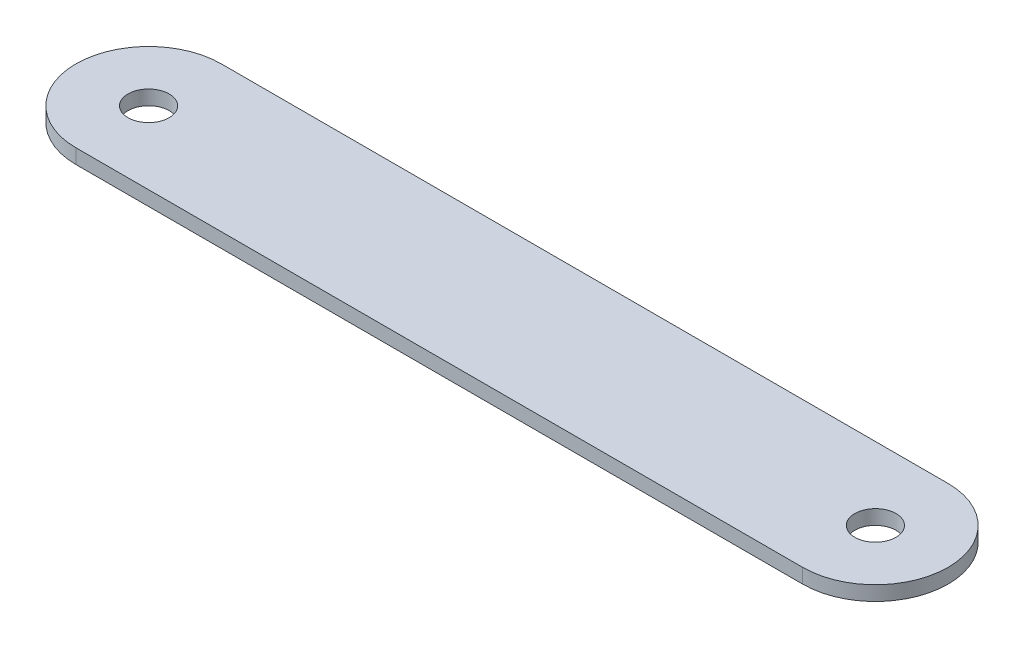
ISO-10303-21;
HEADER;
FILE_DESCRIPTION(('STEP AP214'),'2;1');
FILE_NAME('part.step','',(''),(''),'','','');
FILE_SCHEMA(('AUTOMOTIVE_DESIGN { 1 0 10303 214 1 1 1 1 }'));
ENDSEC;
DATA;
#1=APPLICATION_CONTEXT('core data for automotive mechanical design processes');
#2=APPLICATION_PROTOCOL_DEFINITION('international standard','automotive_design',2000,#1);
#3=PRODUCT_CONTEXT('',#1,'mechanical');
#4=PRODUCT('Part','Part','',(#3));
#5=PRODUCT_RELATED_PRODUCT_CATEGORY('part','',(#4));
#6=PRODUCT_DEFINITION_FORMATION('','',#4);
#7=PRODUCT_DEFINITION_CONTEXT('part definition',#1,'design');
#8=PRODUCT_DEFINITION('design','',#6,#7);
#9=PRODUCT_DEFINITION_SHAPE('','',#8);
#10=(LENGTH_UNIT() NAMED_UNIT(*) SI_UNIT(.MILLI.,.METRE.));
#11=(NAMED_UNIT(*) PLANE_ANGLE_UNIT() SI_UNIT($,.RADIAN.));
#12=(NAMED_UNIT(*) SI_UNIT($,.STERADIAN.) SOLID_ANGLE_UNIT());
#13=UNCERTAINTY_MEASURE_WITH_UNIT(LENGTH_MEASURE(1.E-05),#10,'distance_accuracy_value','');
#14=(GEOMETRIC_REPRESENTATION_CONTEXT(3) GLOBAL_UNCERTAINTY_ASSIGNED_CONTEXT((#13)) GLOBAL_UNIT_ASSIGNED_CONTEXT((#10,
#11,#12)) REPRESENTATION_CONTEXT('',''));
#15=CARTESIAN_POINT('',(0.,0.,0.));
#16=DIRECTION('',(0.,0.,1.));
#17=DIRECTION('',(1.,0.,0.));
#18=AXIS2_PLACEMENT_3D('',#15,#16,#17);
#19=CARTESIAN_POINT('',(100.,3.,0.));
#20=DIRECTION('',(0.,-1.,0.));
#21=DIRECTION('',(0.,0.,-1.));
#22=AXIS2_PLACEMENT_3D('',#19,#20,#21);
#23=CYLINDRICAL_SURFACE('',#22,15.);
#24=CARTESIAN_POINT('',(100.,0.,0.));
#25=DIRECTION('',(0.,1.,0.));
#26=DIRECTION('',(0.,0.,-1.));
#27=AXIS2_PLACEMENT_3D('',#24,#25,#26);
#28=CIRCLE('',#27,15.);
#29=CARTESIAN_POINT('',(100.,0.,15.));
#30=VERTEX_POINT('',#29);
#31=CARTESIAN_POINT('',(100.,0.,-15.));
#32=VERTEX_POINT('',#31);
#33=EDGE_CURVE('E113',#30,#32,#28,.T.);
#34=ORIENTED_EDGE('',*,*,#33,.T.);
#35=DIRECTION('',(0.,-1.,0.));
#36=VECTOR('',#35,1.);
#37=CARTESIAN_POINT('',(100.,3.,-15.));
#38=LINE('',#37,#36);
#39=CARTESIAN_POINT('',(100.,3.,-15.));
#40=VERTEX_POINT('',#39);
#41=EDGE_CURVE('E11',#40,#32,#38,.T.);
#42=ORIENTED_EDGE('',*,*,#41,.F.);
#43=CARTESIAN_POINT('',(100.,3.,0.));
#44=DIRECTION('',(0.,1.,0.));
#45=DIRECTION('',(0.,0.,-1.));
#46=AXIS2_PLACEMENT_3D('',#43,#44,#45);
#47=CIRCLE('',#46,15.);
#48=CARTESIAN_POINT('',(100.,3.,15.));
#49=VERTEX_POINT('',#48);
#50=EDGE_CURVE('E96',#49,#40,#47,.T.);
#51=ORIENTED_EDGE('',*,*,#50,.F.);
#52=DIRECTION('',(0.,-1.,0.));
#53=VECTOR('',#52,1.);
#54=CARTESIAN_POINT('',(100.,3.,15.));
#55=LINE('',#54,#53);
#56=EDGE_CURVE('E109',#49,#30,#55,.T.);
#57=ORIENTED_EDGE('',*,*,#56,.T.);
#58=EDGE_LOOP('',(#34,#42,#51,#57));
#59=FACE_BOUND('',#58,.T.);
#60=ADVANCED_FACE('F42',(#59),#23,.T.);
#61=CARTESIAN_POINT('',(-50.,3.,-15.));
#62=DIRECTION('',(0.,0.,1.));
#63=DIRECTION('',(1.,0.,0.));
#64=AXIS2_PLACEMENT_3D('',#61,#62,#63);
#65=PLANE('',#64);
#66=DIRECTION('',(-1.,0.,0.));
#67=VECTOR('',#66,1.);
#68=CARTESIAN_POINT('',(-50.,0.,-15.));
#69=LINE('',#68,#67);
#70=CARTESIAN_POINT('',(-50.,0.,-15.));
#71=VERTEX_POINT('',#70);
#72=EDGE_CURVE('E101',#32,#71,#69,.T.);
#73=ORIENTED_EDGE('',*,*,#72,.T.);
#74=DIRECTION('',(0.,-1.,0.));
#75=VECTOR('',#74,1.);
#76=CARTESIAN_POINT('',(-50.,3.,-15.));
#77=LINE('',#76,#75);
#78=CARTESIAN_POINT('',(-50.,3.,-15.));
#79=VERTEX_POINT('',#78);
#80=EDGE_CURVE('E52',#79,#71,#77,.T.);
#81=ORIENTED_EDGE('',*,*,#80,.F.);
#82=DIRECTION('',(-1.,0.,0.));
#83=VECTOR('',#82,1.);
#84=CARTESIAN_POINT('',(-50.,3.,-15.));
#85=LINE('',#84,#83);
#86=EDGE_CURVE('E91',#40,#79,#85,.T.);
#87=ORIENTED_EDGE('',*,*,#86,.F.);
#88=ORIENTED_EDGE('',*,*,#41,.T.);
#89=EDGE_LOOP('',(#73,#81,#87,#88));
#90=FACE_BOUND('',#89,.T.);
#91=ADVANCED_FACE('F100',(#90),#65,.F.);
#92=CARTESIAN_POINT('',(-50.,3.,0.));
#93=DIRECTION('',(0.,-1.,0.));
#94=DIRECTION('',(0.,0.,-1.));
#95=AXIS2_PLACEMENT_3D('',#92,#93,#94);
#96=CYLINDRICAL_SURFACE('',#95,15.);
#97=CARTESIAN_POINT('',(-50.,0.,0.));
#98=DIRECTION('',(0.,1.,0.));
#99=DIRECTION('',(0.,0.,1.));
#100=AXIS2_PLACEMENT_3D('',#97,#98,#99);
#101=CIRCLE('',#100,15.);
#102=CARTESIAN_POINT('',(-50.,0.,15.));
#103=VERTEX_POINT('',#102);
#104=EDGE_CURVE('E78',#71,#103,#101,.T.);
#105=ORIENTED_EDGE('',*,*,#104,.T.);
#106=DIRECTION('',(0.,-1.,0.));
#107=VECTOR('',#106,1.);
#108=CARTESIAN_POINT('',(-50.,3.,15.));
#109=LINE('',#108,#107);
#110=CARTESIAN_POINT('',(-50.,3.,15.));
#111=VERTEX_POINT('',#110);
#112=EDGE_CURVE('E103',#111,#103,#109,.T.);
#113=ORIENTED_EDGE('',*,*,#112,.F.);
#114=CARTESIAN_POINT('',(-50.,3.,0.));
#115=DIRECTION('',(0.,1.,0.));
#116=DIRECTION('',(0.,0.,1.));
#117=AXIS2_PLACEMENT_3D('',#114,#115,#116);
#118=CIRCLE('',#117,15.);
#119=EDGE_CURVE('E94',#79,#111,#118,.T.);
#120=ORIENTED_EDGE('',*,*,#119,.F.);
#121=ORIENTED_EDGE('',*,*,#80,.T.);
#122=EDGE_LOOP('',(#105,#113,#120,#121));
#123=FACE_BOUND('',#122,.T.);
#124=ADVANCED_FACE('F105',(#123),#96,.T.);
#125=CARTESIAN_POINT('',(-50.,3.,15.));
#126=DIRECTION('',(0.,0.,-1.));
#127=DIRECTION('',(-1.,0.,0.));
#128=AXIS2_PLACEMENT_3D('',#125,#126,#127);
#129=PLANE('',#128);
#130=DIRECTION('',(1.,0.,0.));
#131=VECTOR('',#130,1.);
#132=CARTESIAN_POINT('',(-50.,0.,15.));
#133=LINE('',#132,#131);
#134=EDGE_CURVE('E84',#103,#30,#133,.T.);
#135=ORIENTED_EDGE('',*,*,#134,.T.);
#136=ORIENTED_EDGE('',*,*,#56,.F.);
#137=DIRECTION('',(1.,0.,0.));
#138=VECTOR('',#137,1.);
#139=CARTESIAN_POINT('',(-50.,3.,15.));
#140=LINE('',#139,#138);
#141=EDGE_CURVE('E61',#111,#49,#140,.T.);
#142=ORIENTED_EDGE('',*,*,#141,.F.);
#143=ORIENTED_EDGE('',*,*,#112,.T.);
#144=EDGE_LOOP('',(#135,#136,#142,#143));
#145=FACE_BOUND('',#144,.T.);
#146=ADVANCED_FACE('F150',(#145),#129,.F.);
#147=CARTESIAN_POINT('',(100.,3.,0.));
#148=DIRECTION('',(0.,-1.,0.));
#149=DIRECTION('',(0.,0.,-1.));
#150=AXIS2_PLACEMENT_3D('',#147,#148,#149);
#151=PLANE('',#150);
#152=CARTESIAN_POINT('',(-50.,3.,0.));
#153=DIRECTION('',(0.,1.,0.));
#154=DIRECTION('',(0.,0.,1.));
#155=AXIS2_PLACEMENT_3D('',#152,#153,#154);
#156=CIRCLE('',#155,4.25000000000001);
#157=CARTESIAN_POINT('',(-50.,3.,4.25000000000001));
#158=VERTEX_POINT('',#157);
#159=EDGE_CURVE('E129',#158,#158,#156,.T.);
#160=ORIENTED_EDGE('',*,*,#159,.F.);
#161=EDGE_LOOP('',(#160));
#162=FACE_BOUND('',#161,.T.);
#163=CARTESIAN_POINT('',(100.,3.,0.));
#164=DIRECTION('',(0.,1.,0.));
#165=DIRECTION('',(0.,0.,-1.));
#166=AXIS2_PLACEMENT_3D('',#163,#164,#165);
#167=CIRCLE('',#166,4.25000000000001);
#168=CARTESIAN_POINT('',(100.,3.,-4.25000000000001));
#169=VERTEX_POINT('',#168);
#170=EDGE_CURVE('E136',#169,#169,#167,.T.);
#171=ORIENTED_EDGE('',*,*,#170,.F.);
#172=EDGE_LOOP('',(#171));
#173=FACE_BOUND('',#172,.T.);
#174=ORIENTED_EDGE('',*,*,#50,.T.);
#175=ORIENTED_EDGE('',*,*,#86,.T.);
#176=ORIENTED_EDGE('',*,*,#119,.T.);
#177=ORIENTED_EDGE('',*,*,#141,.T.);
#178=EDGE_LOOP('',(#174,#175,#176,#177));
#179=FACE_BOUND('',#178,.T.);
#180=ADVANCED_FACE('F92',(#162,#173,#179),#151,.F.);
#181=CARTESIAN_POINT('',(100.,0.,0.));
#182=DIRECTION('',(0.,-1.,0.));
#183=DIRECTION('',(0.,0.,-1.));
#184=AXIS2_PLACEMENT_3D('',#181,#182,#183);
#185=PLANE('',#184);
#186=CARTESIAN_POINT('',(-50.,0.,0.));
#187=DIRECTION('',(0.,-1.,0.));
#188=DIRECTION('',(0.,0.,-1.));
#189=AXIS2_PLACEMENT_3D('',#186,#187,#188);
#190=CIRCLE('',#189,4.25000000000001);
#191=CARTESIAN_POINT('',(-50.,0.,-4.25000000000001));
#192=VERTEX_POINT('',#191);
#193=EDGE_CURVE('E45',#192,#192,#190,.T.);
#194=ORIENTED_EDGE('',*,*,#193,.F.);
#195=EDGE_LOOP('',(#194));
#196=FACE_BOUND('',#195,.T.);
#197=CARTESIAN_POINT('',(100.,0.,0.));
#198=DIRECTION('',(0.,-1.,0.));
#199=DIRECTION('',(0.,0.,-1.));
#200=AXIS2_PLACEMENT_3D('',#197,#198,#199);
#201=CIRCLE('',#200,4.25000000000001);
#202=CARTESIAN_POINT('',(100.,0.,-4.25000000000001));
#203=VERTEX_POINT('',#202);
#204=EDGE_CURVE('E126',#203,#203,#201,.T.);
#205=ORIENTED_EDGE('',*,*,#204,.F.);
#206=EDGE_LOOP('',(#205));
#207=FACE_BOUND('',#206,.T.);
#208=ORIENTED_EDGE('',*,*,#33,.F.);
#209=ORIENTED_EDGE('',*,*,#134,.F.);
#210=ORIENTED_EDGE('',*,*,#104,.F.);
#211=ORIENTED_EDGE('',*,*,#72,.F.);
#212=EDGE_LOOP('',(#208,#209,#210,#211));
#213=FACE_BOUND('',#212,.T.);
#214=ADVANCED_FACE('F149',(#196,#207,#213),#185,.T.);
#215=CARTESIAN_POINT('',(100.,-7.,0.));
#216=DIRECTION('',(0.,1.,0.));
#217=DIRECTION('',(0.,0.,1.));
#218=AXIS2_PLACEMENT_3D('',#215,#216,#217);
#219=CYLINDRICAL_SURFACE('',#218,4.25000000000001);
#220=ORIENTED_EDGE('',*,*,#204,.T.);
#221=EDGE_LOOP('',(#220));
#222=FACE_BOUND('',#221,.T.);
#223=ORIENTED_EDGE('',*,*,#170,.T.);
#224=EDGE_LOOP('',(#223));
#225=FACE_BOUND('',#224,.T.);
#226=ADVANCED_FACE('F146',(#222,#225),#219,.F.);
#227=CARTESIAN_POINT('',(-50.,-7.,0.));
#228=DIRECTION('',(0.,1.,0.));
#229=DIRECTION('',(0.,0.,1.));
#230=AXIS2_PLACEMENT_3D('',#227,#228,#229);
#231=CYLINDRICAL_SURFACE('',#230,4.25000000000001);
#232=ORIENTED_EDGE('',*,*,#193,.T.);
#233=EDGE_LOOP('',(#232));
#234=FACE_BOUND('',#233,.T.);
#235=ORIENTED_EDGE('',*,*,#159,.T.);
#236=EDGE_LOOP('',(#235));
#237=FACE_BOUND('',#236,.T.);
#238=ADVANCED_FACE('F200',(#234,#237),#231,.F.);
#239=CLOSED_SHELL('',(#60,#91,#124,#146,#180,#214,#226,#238));
#240=MANIFOLD_SOLID_BREP('B2',#239);
#241=ADVANCED_BREP_SHAPE_REPRESENTATION('',(#18,#240),#14);
#242=SHAPE_DEFINITION_REPRESENTATION(#9,#241);
ENDSEC;
END-ISO-10303-21;
